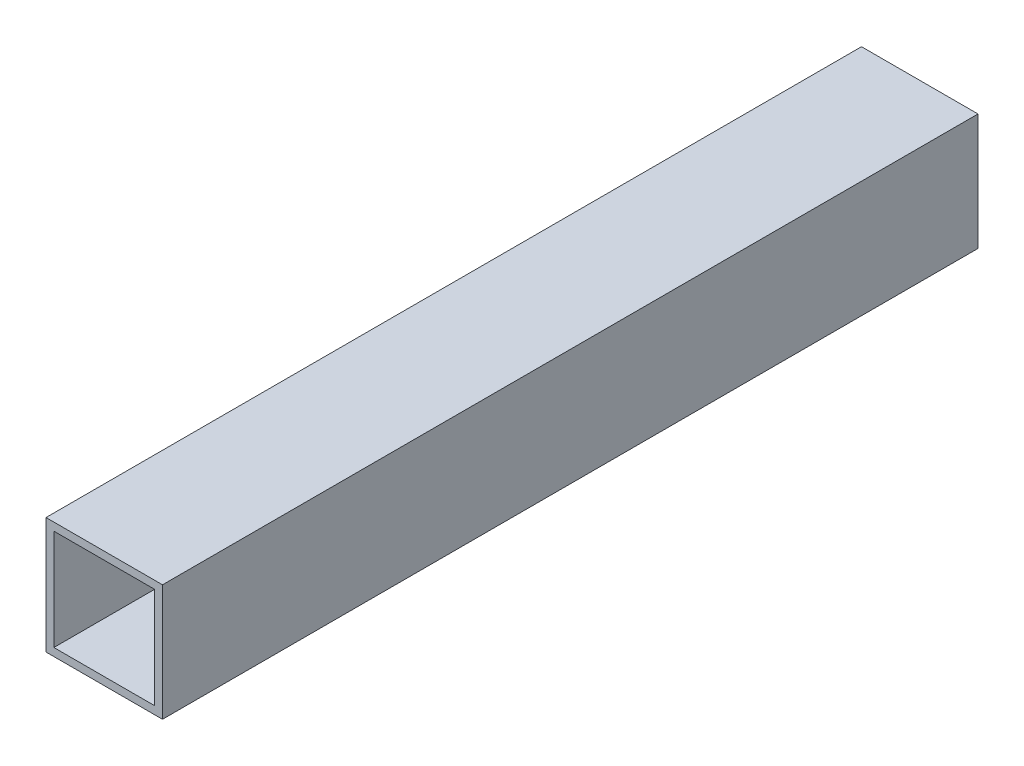
ISO-10303-21;
HEADER;
FILE_DESCRIPTION(('STEP AP214'),'2;1');
FILE_NAME('part.step','',(''),(''),'','','');
FILE_SCHEMA(('AUTOMOTIVE_DESIGN { 1 0 10303 214 1 1 1 1 }'));
ENDSEC;
DATA;
#1=APPLICATION_CONTEXT('core data for automotive mechanical design processes');
#2=APPLICATION_PROTOCOL_DEFINITION('international standard','automotive_design',2000,#1);
#3=PRODUCT_CONTEXT('',#1,'mechanical');
#4=PRODUCT('Part','Part','',(#3));
#5=PRODUCT_RELATED_PRODUCT_CATEGORY('part','',(#4));
#6=PRODUCT_DEFINITION_FORMATION('','',#4);
#7=PRODUCT_DEFINITION_CONTEXT('part definition',#1,'design');
#8=PRODUCT_DEFINITION('design','',#6,#7);
#9=PRODUCT_DEFINITION_SHAPE('','',#8);
#10=(LENGTH_UNIT() NAMED_UNIT(*) SI_UNIT(.MILLI.,.METRE.));
#11=(NAMED_UNIT(*) PLANE_ANGLE_UNIT() SI_UNIT($,.RADIAN.));
#12=(NAMED_UNIT(*) SI_UNIT($,.STERADIAN.) SOLID_ANGLE_UNIT());
#13=UNCERTAINTY_MEASURE_WITH_UNIT(LENGTH_MEASURE(1.E-05),#10,'distance_accuracy_value','');
#14=(GEOMETRIC_REPRESENTATION_CONTEXT(3) GLOBAL_UNCERTAINTY_ASSIGNED_CONTEXT((#13)) GLOBAL_UNIT_ASSIGNED_CONTEXT((#10,
#11,#12)) REPRESENTATION_CONTEXT('',''));
#15=CARTESIAN_POINT('',(0.,0.,0.));
#16=DIRECTION('',(0.,0.,1.));
#17=DIRECTION('',(1.,0.,0.));
#18=AXIS2_PLACEMENT_3D('',#15,#16,#17);
#19=CARTESIAN_POINT('',(0.,0.,88.9));
#20=DIRECTION('',(0.,0.,-1.));
#21=DIRECTION('',(-1.,0.,0.));
#22=AXIS2_PLACEMENT_3D('',#19,#20,#21);
#23=PLANE('',#22);
#24=DIRECTION('',(0.,1.,0.));
#25=VECTOR('',#24,1.);
#26=CARTESIAN_POINT('',(12.7,-12.7,88.9));
#27=LINE('',#26,#25);
#28=CARTESIAN_POINT('',(12.7,-12.7,88.9));
#29=VERTEX_POINT('',#28);
#30=CARTESIAN_POINT('',(12.7,12.7,88.9));
#31=VERTEX_POINT('',#30);
#32=EDGE_CURVE('E133',#29,#31,#27,.T.);
#33=ORIENTED_EDGE('',*,*,#32,.T.);
#34=DIRECTION('',(-1.,0.,0.));
#35=VECTOR('',#34,1.);
#36=CARTESIAN_POINT('',(-12.7,12.7,88.9));
#37=LINE('',#36,#35);
#38=CARTESIAN_POINT('',(-12.7,12.7,88.9));
#39=VERTEX_POINT('',#38);
#40=EDGE_CURVE('E136',#31,#39,#37,.T.);
#41=ORIENTED_EDGE('',*,*,#40,.T.);
#42=DIRECTION('',(0.,-1.,0.));
#43=VECTOR('',#42,1.);
#44=CARTESIAN_POINT('',(-12.7,-12.7,88.9));
#45=LINE('',#44,#43);
#46=CARTESIAN_POINT('',(-12.7,-12.7,88.9));
#47=VERTEX_POINT('',#46);
#48=EDGE_CURVE('E139',#39,#47,#45,.T.);
#49=ORIENTED_EDGE('',*,*,#48,.T.);
#50=DIRECTION('',(1.,0.,0.));
#51=VECTOR('',#50,1.);
#52=CARTESIAN_POINT('',(-12.7,-12.7,88.9));
#53=LINE('',#52,#51);
#54=EDGE_CURVE('E141',#47,#29,#53,.T.);
#55=ORIENTED_EDGE('',*,*,#54,.T.);
#56=EDGE_LOOP('',(#33,#41,#49,#55));
#57=FACE_BOUND('',#56,.T.);
#58=DIRECTION('',(0.,-1.,0.));
#59=VECTOR('',#58,1.);
#60=CARTESIAN_POINT('',(-10.9855,-10.9855,88.9));
#61=LINE('',#60,#59);
#62=CARTESIAN_POINT('',(-10.9855,10.9855,88.9));
#63=VERTEX_POINT('',#62);
#64=CARTESIAN_POINT('',(-10.9855,-10.9855,88.9));
#65=VERTEX_POINT('',#64);
#66=EDGE_CURVE('E97',#63,#65,#61,.T.);
#67=ORIENTED_EDGE('',*,*,#66,.F.);
#68=DIRECTION('',(-1.,0.,0.));
#69=VECTOR('',#68,1.);
#70=CARTESIAN_POINT('',(-10.9855,10.9855,88.9));
#71=LINE('',#70,#69);
#72=CARTESIAN_POINT('',(10.9855,10.9855,88.9));
#73=VERTEX_POINT('',#72);
#74=EDGE_CURVE('E119',#73,#63,#71,.T.);
#75=ORIENTED_EDGE('',*,*,#74,.F.);
#76=DIRECTION('',(0.,1.,0.));
#77=VECTOR('',#76,1.);
#78=CARTESIAN_POINT('',(10.9855,-10.9855,88.9));
#79=LINE('',#78,#77);
#80=CARTESIAN_POINT('',(10.9855,-10.9855,88.9));
#81=VERTEX_POINT('',#80);
#82=EDGE_CURVE('E117',#81,#73,#79,.T.);
#83=ORIENTED_EDGE('',*,*,#82,.F.);
#84=DIRECTION('',(1.,0.,0.));
#85=VECTOR('',#84,1.);
#86=CARTESIAN_POINT('',(-10.9855,-10.9855,88.9));
#87=LINE('',#86,#85);
#88=EDGE_CURVE('E105',#65,#81,#87,.T.);
#89=ORIENTED_EDGE('',*,*,#88,.F.);
#90=EDGE_LOOP('',(#67,#75,#83,#89));
#91=FACE_BOUND('',#90,.T.);
#92=ADVANCED_FACE('F32',(#57,#91),#23,.F.);
#93=CARTESIAN_POINT('',(0.,0.,-88.9));
#94=DIRECTION('',(0.,0.,-1.));
#95=DIRECTION('',(-1.,0.,0.));
#96=AXIS2_PLACEMENT_3D('',#93,#94,#95);
#97=PLANE('',#96);
#98=DIRECTION('',(0.,1.,0.));
#99=VECTOR('',#98,1.);
#100=CARTESIAN_POINT('',(12.7,-12.7,-88.9));
#101=LINE('',#100,#99);
#102=CARTESIAN_POINT('',(12.7,-12.7,-88.9));
#103=VERTEX_POINT('',#102);
#104=CARTESIAN_POINT('',(12.7,12.7,-88.9));
#105=VERTEX_POINT('',#104);
#106=EDGE_CURVE('E113',#103,#105,#101,.T.);
#107=ORIENTED_EDGE('',*,*,#106,.F.);
#108=DIRECTION('',(1.,0.,0.));
#109=VECTOR('',#108,1.);
#110=CARTESIAN_POINT('',(-12.7,-12.7,-88.9));
#111=LINE('',#110,#109);
#112=CARTESIAN_POINT('',(-12.7,-12.7,-88.9));
#113=VERTEX_POINT('',#112);
#114=EDGE_CURVE('E137',#113,#103,#111,.T.);
#115=ORIENTED_EDGE('',*,*,#114,.F.);
#116=DIRECTION('',(0.,-1.,0.));
#117=VECTOR('',#116,1.);
#118=CARTESIAN_POINT('',(-12.7,-12.7,-88.9));
#119=LINE('',#118,#117);
#120=CARTESIAN_POINT('',(-12.7,12.7,-88.9));
#121=VERTEX_POINT('',#120);
#122=EDGE_CURVE('E148',#121,#113,#119,.T.);
#123=ORIENTED_EDGE('',*,*,#122,.F.);
#124=DIRECTION('',(-1.,0.,0.));
#125=VECTOR('',#124,1.);
#126=CARTESIAN_POINT('',(-12.7,12.7,-88.9));
#127=LINE('',#126,#125);
#128=EDGE_CURVE('E146',#105,#121,#127,.T.);
#129=ORIENTED_EDGE('',*,*,#128,.F.);
#130=EDGE_LOOP('',(#107,#115,#123,#129));
#131=FACE_BOUND('',#130,.T.);
#132=DIRECTION('',(-1.,0.,0.));
#133=VECTOR('',#132,1.);
#134=CARTESIAN_POINT('',(-10.9855,10.9855,-88.9));
#135=LINE('',#134,#133);
#136=CARTESIAN_POINT('',(10.9855,10.9855,-88.9));
#137=VERTEX_POINT('',#136);
#138=CARTESIAN_POINT('',(-10.9855,10.9855,-88.9));
#139=VERTEX_POINT('',#138);
#140=EDGE_CURVE('E106',#137,#139,#135,.T.);
#141=ORIENTED_EDGE('',*,*,#140,.T.);
#142=DIRECTION('',(0.,-1.,0.));
#143=VECTOR('',#142,1.);
#144=CARTESIAN_POINT('',(-10.9855,-10.9855,-88.9));
#145=LINE('',#144,#143);
#146=CARTESIAN_POINT('',(-10.9855,-10.9855,-88.9));
#147=VERTEX_POINT('',#146);
#148=EDGE_CURVE('E55',#139,#147,#145,.T.);
#149=ORIENTED_EDGE('',*,*,#148,.T.);
#150=DIRECTION('',(1.,0.,0.));
#151=VECTOR('',#150,1.);
#152=CARTESIAN_POINT('',(-10.9855,-10.9855,-88.9));
#153=LINE('',#152,#151);
#154=CARTESIAN_POINT('',(10.9855,-10.9855,-88.9));
#155=VERTEX_POINT('',#154);
#156=EDGE_CURVE('E112',#147,#155,#153,.T.);
#157=ORIENTED_EDGE('',*,*,#156,.T.);
#158=DIRECTION('',(0.,1.,0.));
#159=VECTOR('',#158,1.);
#160=CARTESIAN_POINT('',(10.9855,-10.9855,-88.9));
#161=LINE('',#160,#159);
#162=EDGE_CURVE('E125',#155,#137,#161,.T.);
#163=ORIENTED_EDGE('',*,*,#162,.T.);
#164=EDGE_LOOP('',(#141,#149,#157,#163));
#165=FACE_BOUND('',#164,.T.);
#166=ADVANCED_FACE('F166',(#131,#165),#97,.T.);
#167=CARTESIAN_POINT('',(12.7,-12.7,88.9));
#168=DIRECTION('',(-1.,0.,0.));
#169=DIRECTION('',(0.,0.,1.));
#170=AXIS2_PLACEMENT_3D('',#167,#168,#169);
#171=PLANE('',#170);
#172=ORIENTED_EDGE('',*,*,#106,.T.);
#173=DIRECTION('',(0.,0.,-1.));
#174=VECTOR('',#173,1.);
#175=CARTESIAN_POINT('',(12.7,12.7,88.9));
#176=LINE('',#175,#174);
#177=EDGE_CURVE('E11',#31,#105,#176,.T.);
#178=ORIENTED_EDGE('',*,*,#177,.F.);
#179=ORIENTED_EDGE('',*,*,#32,.F.);
#180=DIRECTION('',(0.,0.,-1.));
#181=VECTOR('',#180,1.);
#182=CARTESIAN_POINT('',(12.7,-12.7,88.9));
#183=LINE('',#182,#181);
#184=EDGE_CURVE('E143',#29,#103,#183,.T.);
#185=ORIENTED_EDGE('',*,*,#184,.T.);
#186=EDGE_LOOP('',(#172,#178,#179,#185));
#187=FACE_BOUND('',#186,.T.);
#188=ADVANCED_FACE('F34',(#187),#171,.F.);
#189=CARTESIAN_POINT('',(-12.7,12.7,88.9));
#190=DIRECTION('',(0.,-1.,0.));
#191=DIRECTION('',(0.,0.,-1.));
#192=AXIS2_PLACEMENT_3D('',#189,#190,#191);
#193=PLANE('',#192);
#194=ORIENTED_EDGE('',*,*,#128,.T.);
#195=DIRECTION('',(0.,0.,-1.));
#196=VECTOR('',#195,1.);
#197=CARTESIAN_POINT('',(-12.7,12.7,88.9));
#198=LINE('',#197,#196);
#199=EDGE_CURVE('E40',#39,#121,#198,.T.);
#200=ORIENTED_EDGE('',*,*,#199,.F.);
#201=ORIENTED_EDGE('',*,*,#40,.F.);
#202=ORIENTED_EDGE('',*,*,#177,.T.);
#203=EDGE_LOOP('',(#194,#200,#201,#202));
#204=FACE_BOUND('',#203,.T.);
#205=ADVANCED_FACE('F176',(#204),#193,.F.);
#206=CARTESIAN_POINT('',(-12.7,-12.7,88.9));
#207=DIRECTION('',(1.,0.,0.));
#208=DIRECTION('',(0.,0.,-1.));
#209=AXIS2_PLACEMENT_3D('',#206,#207,#208);
#210=PLANE('',#209);
#211=ORIENTED_EDGE('',*,*,#122,.T.);
#212=DIRECTION('',(0.,0.,-1.));
#213=VECTOR('',#212,1.);
#214=CARTESIAN_POINT('',(-12.7,-12.7,88.9));
#215=LINE('',#214,#213);
#216=EDGE_CURVE('E153',#47,#113,#215,.T.);
#217=ORIENTED_EDGE('',*,*,#216,.F.);
#218=ORIENTED_EDGE('',*,*,#48,.F.);
#219=ORIENTED_EDGE('',*,*,#199,.T.);
#220=EDGE_LOOP('',(#211,#217,#218,#219));
#221=FACE_BOUND('',#220,.T.);
#222=ADVANCED_FACE('F160',(#221),#210,.F.);
#223=CARTESIAN_POINT('',(-12.7,-12.7,88.9));
#224=DIRECTION('',(0.,1.,0.));
#225=DIRECTION('',(0.,0.,1.));
#226=AXIS2_PLACEMENT_3D('',#223,#224,#225);
#227=PLANE('',#226);
#228=ORIENTED_EDGE('',*,*,#114,.T.);
#229=ORIENTED_EDGE('',*,*,#184,.F.);
#230=ORIENTED_EDGE('',*,*,#54,.F.);
#231=ORIENTED_EDGE('',*,*,#216,.T.);
#232=EDGE_LOOP('',(#228,#229,#230,#231));
#233=FACE_BOUND('',#232,.T.);
#234=ADVANCED_FACE('F170',(#233),#227,.F.);
#235=CARTESIAN_POINT('',(-10.9855,-10.9855,88.9));
#236=DIRECTION('',(1.,0.,0.));
#237=DIRECTION('',(0.,0.,-1.));
#238=AXIS2_PLACEMENT_3D('',#235,#236,#237);
#239=PLANE('',#238);
#240=ORIENTED_EDGE('',*,*,#148,.F.);
#241=DIRECTION('',(0.,0.,-1.));
#242=VECTOR('',#241,1.);
#243=CARTESIAN_POINT('',(-10.9855,10.9855,88.9));
#244=LINE('',#243,#242);
#245=EDGE_CURVE('E101',#63,#139,#244,.T.);
#246=ORIENTED_EDGE('',*,*,#245,.F.);
#247=ORIENTED_EDGE('',*,*,#66,.T.);
#248=DIRECTION('',(0.,0.,-1.));
#249=VECTOR('',#248,1.);
#250=CARTESIAN_POINT('',(-10.9855,-10.9855,88.9));
#251=LINE('',#250,#249);
#252=EDGE_CURVE('E100',#65,#147,#251,.T.);
#253=ORIENTED_EDGE('',*,*,#252,.T.);
#254=EDGE_LOOP('',(#240,#246,#247,#253));
#255=FACE_BOUND('',#254,.T.);
#256=ADVANCED_FACE('F99',(#255),#239,.T.);
#257=CARTESIAN_POINT('',(-10.9855,-10.9855,88.9));
#258=DIRECTION('',(0.,1.,0.));
#259=DIRECTION('',(0.,0.,1.));
#260=AXIS2_PLACEMENT_3D('',#257,#258,#259);
#261=PLANE('',#260);
#262=ORIENTED_EDGE('',*,*,#156,.F.);
#263=ORIENTED_EDGE('',*,*,#252,.F.);
#264=ORIENTED_EDGE('',*,*,#88,.T.);
#265=DIRECTION('',(0.,0.,-1.));
#266=VECTOR('',#265,1.);
#267=CARTESIAN_POINT('',(10.9855,-10.9855,88.9));
#268=LINE('',#267,#266);
#269=EDGE_CURVE('E114',#81,#155,#268,.T.);
#270=ORIENTED_EDGE('',*,*,#269,.T.);
#271=EDGE_LOOP('',(#262,#263,#264,#270));
#272=FACE_BOUND('',#271,.T.);
#273=ADVANCED_FACE('F109',(#272),#261,.T.);
#274=CARTESIAN_POINT('',(10.9855,-10.9855,88.9));
#275=DIRECTION('',(-1.,0.,0.));
#276=DIRECTION('',(0.,0.,1.));
#277=AXIS2_PLACEMENT_3D('',#274,#275,#276);
#278=PLANE('',#277);
#279=ORIENTED_EDGE('',*,*,#162,.F.);
#280=ORIENTED_EDGE('',*,*,#269,.F.);
#281=ORIENTED_EDGE('',*,*,#82,.T.);
#282=DIRECTION('',(0.,0.,-1.));
#283=VECTOR('',#282,1.);
#284=CARTESIAN_POINT('',(10.9855,10.9855,88.9));
#285=LINE('',#284,#283);
#286=EDGE_CURVE('E47',#73,#137,#285,.T.);
#287=ORIENTED_EDGE('',*,*,#286,.T.);
#288=EDGE_LOOP('',(#279,#280,#281,#287));
#289=FACE_BOUND('',#288,.T.);
#290=ADVANCED_FACE('F199',(#289),#278,.T.);
#291=CARTESIAN_POINT('',(-10.9855,10.9855,88.9));
#292=DIRECTION('',(0.,-1.,0.));
#293=DIRECTION('',(0.,0.,-1.));
#294=AXIS2_PLACEMENT_3D('',#291,#292,#293);
#295=PLANE('',#294);
#296=ORIENTED_EDGE('',*,*,#140,.F.);
#297=ORIENTED_EDGE('',*,*,#286,.F.);
#298=ORIENTED_EDGE('',*,*,#74,.T.);
#299=ORIENTED_EDGE('',*,*,#245,.T.);
#300=EDGE_LOOP('',(#296,#297,#298,#299));
#301=FACE_BOUND('',#300,.T.);
#302=ADVANCED_FACE('F203',(#301),#295,.T.);
#303=CLOSED_SHELL('',(#92,#166,#188,#205,#222,#234,#256,#273,#290,#302));
#304=MANIFOLD_SOLID_BREP('B2',#303);
#305=ADVANCED_BREP_SHAPE_REPRESENTATION('',(#18,#304),#14);
#306=SHAPE_DEFINITION_REPRESENTATION(#9,#305);
ENDSEC;
END-ISO-10303-21;
